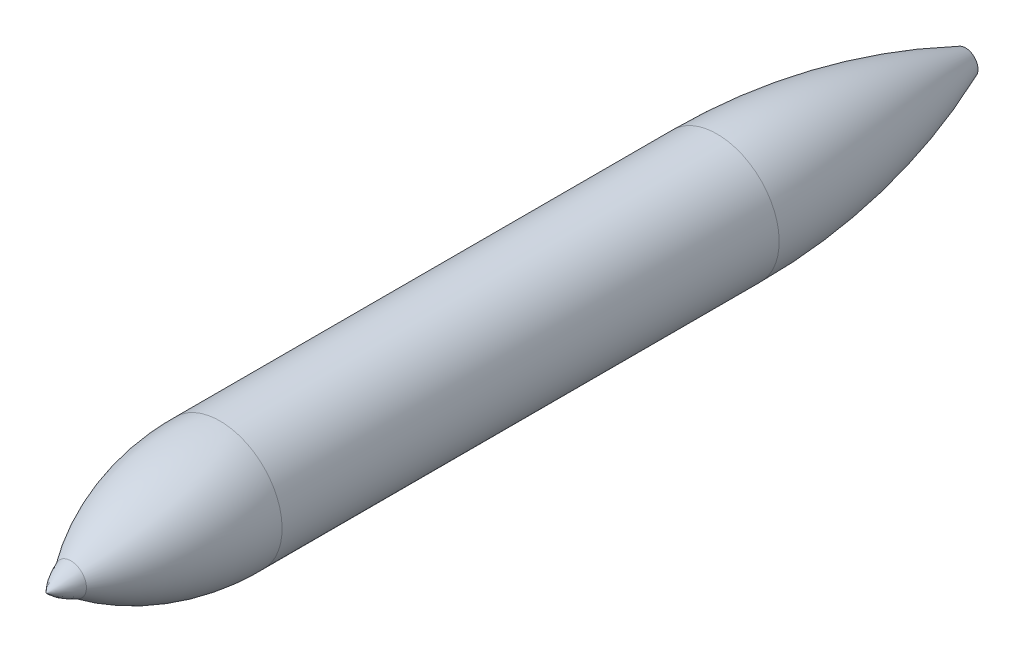
ISO-10303-21;
HEADER;
FILE_DESCRIPTION(('STEP AP214'),'2;1');
FILE_NAME('part.step','',(''),(''),'','','');
FILE_SCHEMA(('AUTOMOTIVE_DESIGN { 1 0 10303 214 1 1 1 1 }'));
ENDSEC;
DATA;
#1=APPLICATION_CONTEXT('core data for automotive mechanical design processes');
#2=APPLICATION_PROTOCOL_DEFINITION('international standard','automotive_design',2000,#1);
#3=PRODUCT_CONTEXT('',#1,'mechanical');
#4=PRODUCT('Part','Part','',(#3));
#5=PRODUCT_RELATED_PRODUCT_CATEGORY('part','',(#4));
#6=PRODUCT_DEFINITION_FORMATION('','',#4);
#7=PRODUCT_DEFINITION_CONTEXT('part definition',#1,'design');
#8=PRODUCT_DEFINITION('design','',#6,#7);
#9=PRODUCT_DEFINITION_SHAPE('','',#8);
#10=(LENGTH_UNIT() NAMED_UNIT(*) SI_UNIT(.MILLI.,.METRE.));
#11=(NAMED_UNIT(*) PLANE_ANGLE_UNIT() SI_UNIT($,.RADIAN.));
#12=(NAMED_UNIT(*) SI_UNIT($,.STERADIAN.) SOLID_ANGLE_UNIT());
#13=UNCERTAINTY_MEASURE_WITH_UNIT(LENGTH_MEASURE(1.E-05),#10,'distance_accuracy_value','');
#14=(GEOMETRIC_REPRESENTATION_CONTEXT(3) GLOBAL_UNCERTAINTY_ASSIGNED_CONTEXT((#13)) GLOBAL_UNIT_ASSIGNED_CONTEXT((#10,
#11,#12)) REPRESENTATION_CONTEXT('',''));
#15=CARTESIAN_POINT('',(0.,0.,0.));
#16=DIRECTION('',(0.,0.,1.));
#17=DIRECTION('',(1.,0.,0.));
#18=AXIS2_PLACEMENT_3D('',#15,#16,#17);
#19=CARTESIAN_POINT('',(0.,183.180515509881,515.487402225392));
#20=DIRECTION('',(-1.,0.,0.));
#21=DIRECTION('',(0.,-1.,0.));
#22=AXIS2_PLACEMENT_3D('',#19,#20,#21);
#23=CIRCLE('',#22,260.);
#24=TRIMMED_CURVE('',#23,(PARAMETER_VALUE(-0.789020957485495)),
(PARAMETER_VALUE(0.789020957485495)),.T.,.PARAMETER.);
#25=CARTESIAN_POINT('',(0.,0.,515.487402225392));
#26=DIRECTION('',(0.,0.,1.));
#27=AXIS1_PLACEMENT('',#25,#26);
#28=SURFACE_OF_REVOLUTION('',#24,#27);
#29=CARTESIAN_POINT('',(0.,0.,700.));
#30=VERTEX_POINT('',#29);
#31=VERTEX_LOOP('',#30);
#32=FACE_BOUND('',#31,.T.);
#33=CARTESIAN_POINT('',(0.,0.,600.));
#34=DIRECTION('',(0.,0.,1.));
#35=DIRECTION('',(0.,-1.,0.));
#36=AXIS2_PLACEMENT_3D('',#33,#34,#35);
#37=CIRCLE('',#36,62.7007989843019);
#38=CARTESIAN_POINT('',(0.,-62.7007989843019,600.));
#39=VERTEX_POINT('',#38);
#40=EDGE_CURVE('E11',#39,#39,#37,.T.);
#41=ORIENTED_EDGE('',*,*,#40,.T.);
#42=EDGE_LOOP('',(#41));
#43=FACE_BOUND('',#42,.T.);
#44=ADVANCED_FACE('F38',(#32,#43),#28,.T.);
#45=CARTESIAN_POINT('',(0.,0.,17.1145450473868));
#46=DIRECTION('',(0.,0.,1.));
#47=DIRECTION('',(0.,-1.,0.));
#48=AXIS2_PLACEMENT_3D('',#45,#46,#47);
#49=DEGENERATE_TOROIDAL_SURFACE('',#48,749.853535447978,1000.,.F.);
#50=ORIENTED_EDGE('',*,*,#40,.F.);
#51=EDGE_LOOP('',(#50));
#52=FACE_BOUND('',#51,.T.);
#53=CARTESIAN_POINT('',(0.,0.,0.));
#54=DIRECTION('',(0.,0.,1.));
#55=DIRECTION('',(0.,-1.,0.));
#56=AXIS2_PLACEMENT_3D('',#53,#54,#55);
#57=CIRCLE('',#56,250.);
#58=CARTESIAN_POINT('',(0.,-250.,0.));
#59=VERTEX_POINT('',#58);
#60=EDGE_CURVE('E46',#59,#59,#57,.T.);
#61=ORIENTED_EDGE('',*,*,#60,.T.);
#62=EDGE_LOOP('',(#61));
#63=FACE_BOUND('',#62,.T.);
#64=ADVANCED_FACE('F54',(#52,#63),#49,.F.);
#65=CARTESIAN_POINT('',(0.,0.,-2970.));
#66=DIRECTION('',(0.,0.,1.));
#67=DIRECTION('',(0.,-1.,0.));
#68=AXIS2_PLACEMENT_3D('',#65,#66,#67);
#69=CYLINDRICAL_SURFACE('',#68,250.);
#70=ORIENTED_EDGE('',*,*,#60,.F.);
#71=EDGE_LOOP('',(#70));
#72=FACE_BOUND('',#71,.T.);
#73=CARTESIAN_POINT('',(0.,0.,-2000.));
#74=DIRECTION('',(0.,0.,1.));
#75=DIRECTION('',(0.,-1.,0.));
#76=AXIS2_PLACEMENT_3D('',#73,#74,#75);
#77=CIRCLE('',#76,250.);
#78=CARTESIAN_POINT('',(0.,-250.,-2000.));
#79=VERTEX_POINT('',#78);
#80=EDGE_CURVE('E63',#79,#79,#77,.T.);
#81=ORIENTED_EDGE('',*,*,#80,.T.);
#82=EDGE_LOOP('',(#81));
#83=FACE_BOUND('',#82,.T.);
#84=ADVANCED_FACE('F59',(#72,#83),#69,.T.);
#85=CARTESIAN_POINT('',(0.,0.,-2000.));
#86=DIRECTION('',(0.,0.,1.));
#87=DIRECTION('',(0.,-1.,0.));
#88=AXIS2_PLACEMENT_3D('',#85,#86,#87);
#89=DEGENERATE_TOROIDAL_SURFACE('',#88,2350.,2600.,.F.);
#90=ORIENTED_EDGE('',*,*,#80,.F.);
#91=EDGE_LOOP('',(#90));
#92=FACE_BOUND('',#91,.T.);
#93=CARTESIAN_POINT('',(0.,0.,-3000.));
#94=DIRECTION('',(0.,0.,1.));
#95=DIRECTION('',(0.,-1.,0.));
#96=AXIS2_PLACEMENT_3D('',#93,#94,#95);
#97=CIRCLE('',#96,50.);
#98=CARTESIAN_POINT('',(0.,-50.,-3000.));
#99=VERTEX_POINT('',#98);
#100=EDGE_CURVE('E65',#99,#99,#97,.T.);
#101=ORIENTED_EDGE('',*,*,#100,.T.);
#102=EDGE_LOOP('',(#101));
#103=FACE_BOUND('',#102,.T.);
#104=ADVANCED_FACE('F110',(#92,#103),#89,.F.);
#105=CARTESIAN_POINT('',(0.,50.,-3000.));
#106=DIRECTION('',(0.,0.,1.));
#107=DIRECTION('',(0.,-1.,0.));
#108=AXIS2_PLACEMENT_3D('',#105,#106,#107);
#109=PLANE('',#108);
#110=ORIENTED_EDGE('',*,*,#100,.F.);
#111=EDGE_LOOP('',(#110));
#112=FACE_BOUND('',#111,.T.);
#113=ADVANCED_FACE('F108',(#112),#109,.F.);
#114=CLOSED_SHELL('',(#44,#64,#84,#104,#113));
#115=CARTESIAN_POINT('',(0.,29.9159649029628,-2970.));
#116=DIRECTION('',(0.,0.,-1.));
#117=DIRECTION('',(0.,1.,0.));
#118=AXIS2_PLACEMENT_3D('',#115,#116,#117);
#119=PLANE('',#118);
#120=CARTESIAN_POINT('',(0.,0.,-2970.));
#121=DIRECTION('',(0.,0.,1.));
#122=DIRECTION('',(0.,-1.,0.));
#123=AXIS2_PLACEMENT_3D('',#120,#121,#122);
#124=CIRCLE('',#123,29.9159649029628);
#125=CARTESIAN_POINT('',(0.,-29.9159649029628,-2970.));
#126=VERTEX_POINT('',#125);
#127=EDGE_CURVE('E70',#126,#126,#124,.T.);
#128=ORIENTED_EDGE('',*,*,#127,.T.);
#129=EDGE_LOOP('',(#128));
#130=FACE_BOUND('',#129,.T.);
#131=ADVANCED_FACE('F95',(#130),#119,.F.);
#132=CARTESIAN_POINT('',(0.,0.,-2000.));
#133=DIRECTION('',(0.,0.,1.));
#134=DIRECTION('',(0.,-1.,0.));
#135=AXIS2_PLACEMENT_3D('',#132,#133,#134);
#136=DEGENERATE_TOROIDAL_SURFACE('',#135,2350.,2570.,.F.);
#137=ORIENTED_EDGE('',*,*,#127,.F.);
#138=EDGE_LOOP('',(#137));
#139=FACE_BOUND('',#138,.T.);
#140=CARTESIAN_POINT('',(0.,0.,-2000.));
#141=DIRECTION('',(0.,0.,1.));
#142=DIRECTION('',(0.,-1.,0.));
#143=AXIS2_PLACEMENT_3D('',#140,#141,#142);
#144=CIRCLE('',#143,220.);
#145=CARTESIAN_POINT('',(0.,-220.,-2000.));
#146=VERTEX_POINT('',#145);
#147=EDGE_CURVE('E73',#146,#146,#144,.T.);
#148=ORIENTED_EDGE('',*,*,#147,.T.);
#149=EDGE_LOOP('',(#148));
#150=FACE_BOUND('',#149,.T.);
#151=ADVANCED_FACE('F97',(#139,#150),#136,.T.);
#152=CARTESIAN_POINT('',(0.,0.,-2970.));
#153=DIRECTION('',(0.,0.,1.));
#154=DIRECTION('',(0.,-1.,0.));
#155=AXIS2_PLACEMENT_3D('',#152,#153,#154);
#156=CYLINDRICAL_SURFACE('',#155,220.);
#157=ORIENTED_EDGE('',*,*,#147,.F.);
#158=EDGE_LOOP('',(#157));
#159=FACE_BOUND('',#158,.T.);
#160=CARTESIAN_POINT('',(0.,0.,0.258692085944201));
#161=DIRECTION('',(0.,0.,1.));
#162=DIRECTION('',(0.,-1.,0.));
#163=AXIS2_PLACEMENT_3D('',#160,#161,#162);
#164=CIRCLE('',#163,220.);
#165=CARTESIAN_POINT('',(0.,-220.,0.258692085944201));
#166=VERTEX_POINT('',#165);
#167=EDGE_CURVE('E76',#166,#166,#164,.T.);
#168=ORIENTED_EDGE('',*,*,#167,.T.);
#169=EDGE_LOOP('',(#168));
#170=FACE_BOUND('',#169,.T.);
#171=ADVANCED_FACE('F92',(#159,#170),#156,.F.);
#172=CARTESIAN_POINT('',(0.,0.,17.1145450473868));
#173=DIRECTION('',(0.,0.,1.));
#174=DIRECTION('',(0.,-1.,0.));
#175=AXIS2_PLACEMENT_3D('',#172,#173,#174);
#176=DEGENERATE_TOROIDAL_SURFACE('',#175,749.853535447978,970.,.F.);
#177=ORIENTED_EDGE('',*,*,#167,.F.);
#178=EDGE_LOOP('',(#177));
#179=FACE_BOUND('',#178,.T.);
#180=CARTESIAN_POINT('',(0.,0.,586.291328986237));
#181=DIRECTION('',(0.,0.,1.));
#182=DIRECTION('',(0.,-1.,0.));
#183=AXIS2_PLACEMENT_3D('',#180,#181,#182);
#184=CIRCLE('',#183,35.6003388342914);
#185=CARTESIAN_POINT('',(0.,-35.6003388342914,586.291328986237));
#186=VERTEX_POINT('',#185);
#187=EDGE_CURVE('E79',#186,#186,#184,.T.);
#188=ORIENTED_EDGE('',*,*,#187,.T.);
#189=EDGE_LOOP('',(#188));
#190=FACE_BOUND('',#189,.T.);
#191=ADVANCED_FACE('F83',(#179,#190),#176,.T.);
#192=CARTESIAN_POINT('',(0.,174.471649560236,520.947930758293));
#193=DIRECTION('',(-1.,0.,0.));
#194=DIRECTION('',(0.,-1.,0.));
#195=AXIS2_PLACEMENT_3D('',#192,#193,#194);
#196=CIRCLE('',#195,220.000000000014);
#197=TRIMMED_CURVE('',#196,(PARAMETER_VALUE(-0.654991751792575)),
(PARAMETER_VALUE(0.654991751792575)),.T.,.PARAMETER.);
#198=CARTESIAN_POINT('',(0.,0.,520.947930758293));
#199=DIRECTION('',(0.,0.,1.));
#200=AXIS1_PLACEMENT('',#198,#199);
#201=SURFACE_OF_REVOLUTION('',#197,#200);
#202=ORIENTED_EDGE('',*,*,#187,.F.);
#203=EDGE_LOOP('',(#202));
#204=FACE_BOUND('',#203,.T.);
#205=CARTESIAN_POINT('',(0.,0.,654.961525216976));
#206=VERTEX_POINT('',#205);
#207=VERTEX_LOOP('',#206);
#208=FACE_BOUND('',#207,.T.);
#209=ADVANCED_FACE('F85',(#204,#208),#201,.F.);
#210=CLOSED_SHELL('',(#131,#151,#171,#191,#209));
#211=ORIENTED_CLOSED_SHELL('',*,#210,.T.);
#212=BREP_WITH_VOIDS('B2',#114,(#211));
#213=ADVANCED_BREP_SHAPE_REPRESENTATION('',(#18,#212),#14);
#214=SHAPE_DEFINITION_REPRESENTATION(#9,#213);
ENDSEC;
END-ISO-10303-21;
